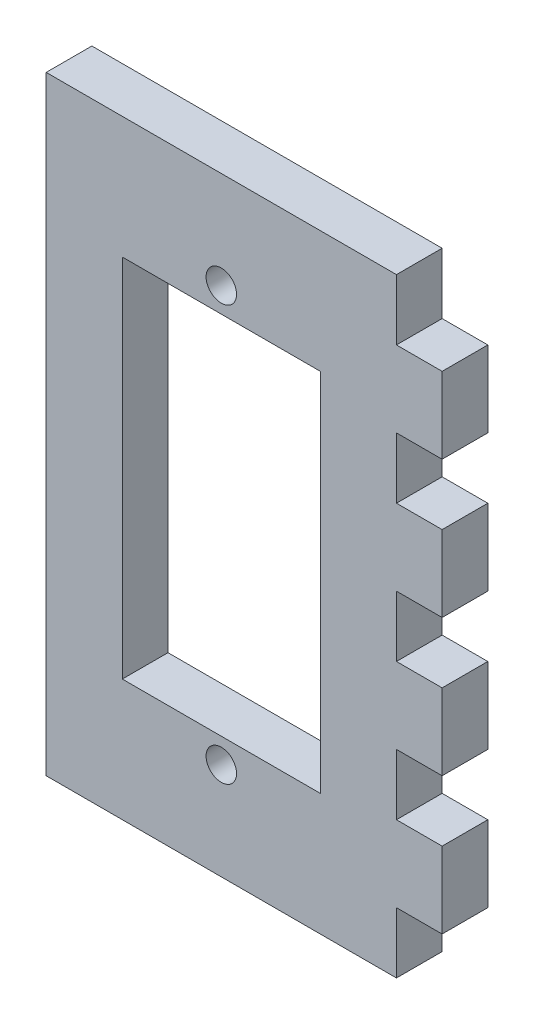
ISO-10303-21;
HEADER;
FILE_DESCRIPTION(('STEP AP214'),'2;1');
FILE_NAME('part.step','',(''),(''),'','','');
FILE_SCHEMA(('AUTOMOTIVE_DESIGN { 1 0 10303 214 1 1 1 1 }'));
ENDSEC;
DATA;
#1=APPLICATION_CONTEXT('core data for automotive mechanical design processes');
#2=APPLICATION_PROTOCOL_DEFINITION('international standard','automotive_design',2000,#1);
#3=PRODUCT_CONTEXT('',#1,'mechanical');
#4=PRODUCT('Part','Part','',(#3));
#5=PRODUCT_RELATED_PRODUCT_CATEGORY('part','',(#4));
#6=PRODUCT_DEFINITION_FORMATION('','',#4);
#7=PRODUCT_DEFINITION_CONTEXT('part definition',#1,'design');
#8=PRODUCT_DEFINITION('design','',#6,#7);
#9=PRODUCT_DEFINITION_SHAPE('','',#8);
#10=(LENGTH_UNIT() NAMED_UNIT(*) SI_UNIT(.MILLI.,.METRE.));
#11=(NAMED_UNIT(*) PLANE_ANGLE_UNIT() SI_UNIT($,.RADIAN.));
#12=(NAMED_UNIT(*) SI_UNIT($,.STERADIAN.) SOLID_ANGLE_UNIT());
#13=UNCERTAINTY_MEASURE_WITH_UNIT(LENGTH_MEASURE(1.E-05),#10,'distance_accuracy_value','');
#14=(GEOMETRIC_REPRESENTATION_CONTEXT(3) GLOBAL_UNCERTAINTY_ASSIGNED_CONTEXT((#13)) GLOBAL_UNIT_ASSIGNED_CONTEXT((#10,
#11,#12)) REPRESENTATION_CONTEXT('',''));
#15=CARTESIAN_POINT('',(0.,0.,0.));
#16=DIRECTION('',(0.,0.,1.));
#17=DIRECTION('',(1.,0.,0.));
#18=AXIS2_PLACEMENT_3D('',#15,#16,#17);
#19=CARTESIAN_POINT('',(0.,0.,3.));
#20=DIRECTION('',(0.,0.,-1.));
#21=DIRECTION('',(-1.,0.,0.));
#22=AXIS2_PLACEMENT_3D('',#19,#20,#21);
#23=PLANE('',#22);
#24=CARTESIAN_POINT('',(0.,13.625,3.));
#25=DIRECTION('',(0.,0.,1.));
#26=DIRECTION('',(1.,0.,0.));
#27=AXIS2_PLACEMENT_3D('',#24,#25,#26);
#28=CIRCLE('',#27,1.);
#29=CARTESIAN_POINT('',(1.,13.625,3.));
#30=VERTEX_POINT('',#29);
#31=EDGE_CURVE('E223',#30,#30,#28,.T.);
#32=ORIENTED_EDGE('',*,*,#31,.F.);
#33=EDGE_LOOP('',(#32));
#34=FACE_BOUND('',#33,.T.);
#35=DIRECTION('',(0.,1.,0.));
#36=VECTOR('',#35,1.);
#37=CARTESIAN_POINT('',(11.5,16.,3.));
#38=LINE('',#37,#36);
#39=CARTESIAN_POINT('',(11.5,16.,3.));
#40=VERTEX_POINT('',#39);
#41=CARTESIAN_POINT('',(11.5,20.,3.));
#42=VERTEX_POINT('',#41);
#43=EDGE_CURVE('E233',#40,#42,#38,.T.);
#44=ORIENTED_EDGE('',*,*,#43,.T.);
#45=DIRECTION('',(-1.,0.,0.));
#46=VECTOR('',#45,1.);
#47=CARTESIAN_POINT('',(-11.5,20.,3.));
#48=LINE('',#47,#46);
#49=CARTESIAN_POINT('',(-11.5,20.,3.));
#50=VERTEX_POINT('',#49);
#51=EDGE_CURVE('E236',#42,#50,#48,.T.);
#52=ORIENTED_EDGE('',*,*,#51,.T.);
#53=DIRECTION('',(0.,-1.,0.));
#54=VECTOR('',#53,1.);
#55=CARTESIAN_POINT('',(-11.5,-20.,3.));
#56=LINE('',#55,#54);
#57=CARTESIAN_POINT('',(-11.5,-20.,3.));
#58=VERTEX_POINT('',#57);
#59=EDGE_CURVE('E239',#50,#58,#56,.T.);
#60=ORIENTED_EDGE('',*,*,#59,.T.);
#61=DIRECTION('',(1.,0.,0.));
#62=VECTOR('',#61,1.);
#63=CARTESIAN_POINT('',(-11.5,-20.,3.));
#64=LINE('',#63,#62);
#65=CARTESIAN_POINT('',(11.5,-20.,3.));
#66=VERTEX_POINT('',#65);
#67=EDGE_CURVE('E241',#58,#66,#64,.T.);
#68=ORIENTED_EDGE('',*,*,#67,.T.);
#69=DIRECTION('',(0.,1.,0.));
#70=VECTOR('',#69,1.);
#71=CARTESIAN_POINT('',(11.5,-20.,3.));
#72=LINE('',#71,#70);
#73=CARTESIAN_POINT('',(11.5,-16.,3.));
#74=VERTEX_POINT('',#73);
#75=EDGE_CURVE('E243',#66,#74,#72,.T.);
#76=ORIENTED_EDGE('',*,*,#75,.T.);
#77=DIRECTION('',(1.,0.,0.));
#78=VECTOR('',#77,1.);
#79=CARTESIAN_POINT('',(11.5,-16.,3.));
#80=LINE('',#79,#78);
#81=CARTESIAN_POINT('',(14.5,-16.,3.));
#82=VERTEX_POINT('',#81);
#83=EDGE_CURVE('E245',#74,#82,#80,.T.);
#84=ORIENTED_EDGE('',*,*,#83,.T.);
#85=DIRECTION('',(0.,1.,0.));
#86=VECTOR('',#85,1.);
#87=CARTESIAN_POINT('',(14.5,-16.,3.));
#88=LINE('',#87,#86);
#89=CARTESIAN_POINT('',(14.5,-11.,3.));
#90=VERTEX_POINT('',#89);
#91=EDGE_CURVE('E247',#82,#90,#88,.T.);
#92=ORIENTED_EDGE('',*,*,#91,.T.);
#93=DIRECTION('',(-1.,0.,0.));
#94=VECTOR('',#93,1.);
#95=CARTESIAN_POINT('',(14.5,-11.,3.));
#96=LINE('',#95,#94);
#97=CARTESIAN_POINT('',(11.5,-11.,3.));
#98=VERTEX_POINT('',#97);
#99=EDGE_CURVE('E249',#90,#98,#96,.T.);
#100=ORIENTED_EDGE('',*,*,#99,.T.);
#101=DIRECTION('',(0.,1.,0.));
#102=VECTOR('',#101,1.);
#103=CARTESIAN_POINT('',(11.5,-11.,3.));
#104=LINE('',#103,#102);
#105=CARTESIAN_POINT('',(11.5,-7.00000000000001,3.));
#106=VERTEX_POINT('',#105);
#107=EDGE_CURVE('E251',#98,#106,#104,.T.);
#108=ORIENTED_EDGE('',*,*,#107,.T.);
#109=DIRECTION('',(1.,0.,0.));
#110=VECTOR('',#109,1.);
#111=CARTESIAN_POINT('',(11.5,-7.00000000000001,3.));
#112=LINE('',#111,#110);
#113=CARTESIAN_POINT('',(14.5,-7.00000000000001,3.));
#114=VERTEX_POINT('',#113);
#115=EDGE_CURVE('E253',#106,#114,#112,.T.);
#116=ORIENTED_EDGE('',*,*,#115,.T.);
#117=DIRECTION('',(0.,1.,0.));
#118=VECTOR('',#117,1.);
#119=CARTESIAN_POINT('',(14.5,-7.00000000000001,3.));
#120=LINE('',#119,#118);
#121=CARTESIAN_POINT('',(14.5,-2.00000000000001,3.));
#122=VERTEX_POINT('',#121);
#123=EDGE_CURVE('E255',#114,#122,#120,.T.);
#124=ORIENTED_EDGE('',*,*,#123,.T.);
#125=DIRECTION('',(-1.,0.,0.));
#126=VECTOR('',#125,1.);
#127=CARTESIAN_POINT('',(14.5,-2.00000000000001,3.));
#128=LINE('',#127,#126);
#129=CARTESIAN_POINT('',(11.5,-2.00000000000001,3.));
#130=VERTEX_POINT('',#129);
#131=EDGE_CURVE('E257',#122,#130,#128,.T.);
#132=ORIENTED_EDGE('',*,*,#131,.T.);
#133=DIRECTION('',(0.,1.,0.));
#134=VECTOR('',#133,1.);
#135=CARTESIAN_POINT('',(11.5,-2.00000000000001,3.));
#136=LINE('',#135,#134);
#137=CARTESIAN_POINT('',(11.5,2.,3.));
#138=VERTEX_POINT('',#137);
#139=EDGE_CURVE('E259',#130,#138,#136,.T.);
#140=ORIENTED_EDGE('',*,*,#139,.T.);
#141=DIRECTION('',(1.,0.,0.));
#142=VECTOR('',#141,1.);
#143=CARTESIAN_POINT('',(14.5,2.,3.));
#144=LINE('',#143,#142);
#145=CARTESIAN_POINT('',(14.5,2.,3.));
#146=VERTEX_POINT('',#145);
#147=EDGE_CURVE('E261',#138,#146,#144,.T.);
#148=ORIENTED_EDGE('',*,*,#147,.T.);
#149=DIRECTION('',(0.,1.,0.));
#150=VECTOR('',#149,1.);
#151=CARTESIAN_POINT('',(14.5,7.00000000000001,3.));
#152=LINE('',#151,#150);
#153=CARTESIAN_POINT('',(14.5,7.00000000000001,3.));
#154=VERTEX_POINT('',#153);
#155=EDGE_CURVE('E263',#146,#154,#152,.T.);
#156=ORIENTED_EDGE('',*,*,#155,.T.);
#157=DIRECTION('',(-1.,0.,0.));
#158=VECTOR('',#157,1.);
#159=CARTESIAN_POINT('',(11.5,7.00000000000001,3.));
#160=LINE('',#159,#158);
#161=CARTESIAN_POINT('',(11.5,7.00000000000001,3.));
#162=VERTEX_POINT('',#161);
#163=EDGE_CURVE('E265',#154,#162,#160,.T.);
#164=ORIENTED_EDGE('',*,*,#163,.T.);
#165=DIRECTION('',(0.,1.,0.));
#166=VECTOR('',#165,1.);
#167=CARTESIAN_POINT('',(11.5,7.00000000000001,3.));
#168=LINE('',#167,#166);
#169=CARTESIAN_POINT('',(11.5,11.,3.));
#170=VERTEX_POINT('',#169);
#171=EDGE_CURVE('E267',#162,#170,#168,.T.);
#172=ORIENTED_EDGE('',*,*,#171,.T.);
#173=DIRECTION('',(1.,0.,0.));
#174=VECTOR('',#173,1.);
#175=CARTESIAN_POINT('',(14.5,11.,3.));
#176=LINE('',#175,#174);
#177=CARTESIAN_POINT('',(14.5,11.,3.));
#178=VERTEX_POINT('',#177);
#179=EDGE_CURVE('E269',#170,#178,#176,.T.);
#180=ORIENTED_EDGE('',*,*,#179,.T.);
#181=DIRECTION('',(0.,1.,0.));
#182=VECTOR('',#181,1.);
#183=CARTESIAN_POINT('',(14.5,16.,3.));
#184=LINE('',#183,#182);
#185=CARTESIAN_POINT('',(14.5,16.,3.));
#186=VERTEX_POINT('',#185);
#187=EDGE_CURVE('E271',#178,#186,#184,.T.);
#188=ORIENTED_EDGE('',*,*,#187,.T.);
#189=DIRECTION('',(-1.,0.,0.));
#190=VECTOR('',#189,1.);
#191=CARTESIAN_POINT('',(11.5,16.,3.));
#192=LINE('',#191,#190);
#193=EDGE_CURVE('E273',#186,#40,#192,.T.);
#194=ORIENTED_EDGE('',*,*,#193,.T.);
#195=EDGE_LOOP('',(#44,#52,#60,#68,#76,#84,#92,#100,#108,#116,#124,#132,#140,#148,#156,#164,
#172,#180,#188,#194));
#196=FACE_BOUND('',#195,.T.);
#197=DIRECTION('',(0.,-1.,0.));
#198=VECTOR('',#197,1.);
#199=CARTESIAN_POINT('',(-6.50000000000001,-12.,3.));
#200=LINE('',#199,#198);
#201=CARTESIAN_POINT('',(-6.50000000000001,12.,3.));
#202=VERTEX_POINT('',#201);
#203=CARTESIAN_POINT('',(-6.50000000000001,-12.,3.));
#204=VERTEX_POINT('',#203);
#205=EDGE_CURVE('E194',#202,#204,#200,.T.);
#206=ORIENTED_EDGE('',*,*,#205,.F.);
#207=DIRECTION('',(-1.,0.,0.));
#208=VECTOR('',#207,1.);
#209=CARTESIAN_POINT('',(6.49999999999999,12.,3.));
#210=LINE('',#209,#208);
#211=CARTESIAN_POINT('',(6.49999999999999,12.,3.));
#212=VERTEX_POINT('',#211);
#213=EDGE_CURVE('E217',#212,#202,#210,.T.);
#214=ORIENTED_EDGE('',*,*,#213,.F.);
#215=DIRECTION('',(0.,1.,0.));
#216=VECTOR('',#215,1.);
#217=CARTESIAN_POINT('',(6.49999999999999,-12.,3.));
#218=LINE('',#217,#216);
#219=CARTESIAN_POINT('',(6.49999999999999,-12.,3.));
#220=VERTEX_POINT('',#219);
#221=EDGE_CURVE('E215',#220,#212,#218,.T.);
#222=ORIENTED_EDGE('',*,*,#221,.F.);
#223=DIRECTION('',(1.,0.,0.));
#224=VECTOR('',#223,1.);
#225=CARTESIAN_POINT('',(6.49999999999999,-12.,3.));
#226=LINE('',#225,#224);
#227=EDGE_CURVE('E202',#204,#220,#226,.T.);
#228=ORIENTED_EDGE('',*,*,#227,.F.);
#229=EDGE_LOOP('',(#206,#214,#222,#228));
#230=FACE_BOUND('',#229,.T.);
#231=CARTESIAN_POINT('',(0.,-13.625,3.));
#232=DIRECTION('',(0.,0.,1.));
#233=DIRECTION('',(-1.,0.,0.));
#234=AXIS2_PLACEMENT_3D('',#231,#232,#233);
#235=CIRCLE('',#234,1.);
#236=CARTESIAN_POINT('',(-1.,-13.625,3.));
#237=VERTEX_POINT('',#236);
#238=EDGE_CURVE('E704',#237,#237,#235,.T.);
#239=ORIENTED_EDGE('',*,*,#238,.F.);
#240=EDGE_LOOP('',(#239));
#241=FACE_BOUND('',#240,.T.);
#242=ADVANCED_FACE('F33',(#34,#196,#230,#241),#23,.F.);
#243=CARTESIAN_POINT('',(0.,0.,0.));
#244=DIRECTION('',(0.,0.,-1.));
#245=DIRECTION('',(-1.,0.,0.));
#246=AXIS2_PLACEMENT_3D('',#243,#244,#245);
#247=PLANE('',#246);
#248=CARTESIAN_POINT('',(0.,13.625,0.));
#249=DIRECTION('',(0.,0.,1.));
#250=DIRECTION('',(1.,0.,0.));
#251=AXIS2_PLACEMENT_3D('',#248,#249,#250);
#252=CIRCLE('',#251,1.);
#253=CARTESIAN_POINT('',(1.,13.625,0.));
#254=VERTEX_POINT('',#253);
#255=EDGE_CURVE('E710',#254,#254,#252,.T.);
#256=ORIENTED_EDGE('',*,*,#255,.T.);
#257=EDGE_LOOP('',(#256));
#258=FACE_BOUND('',#257,.T.);
#259=DIRECTION('',(0.,1.,0.));
#260=VECTOR('',#259,1.);
#261=CARTESIAN_POINT('',(11.5,16.,0.));
#262=LINE('',#261,#260);
#263=CARTESIAN_POINT('',(11.5,16.,0.));
#264=VERTEX_POINT('',#263);
#265=CARTESIAN_POINT('',(11.5,20.,0.));
#266=VERTEX_POINT('',#265);
#267=EDGE_CURVE('E210',#264,#266,#262,.T.);
#268=ORIENTED_EDGE('',*,*,#267,.F.);
#269=DIRECTION('',(-1.,0.,0.));
#270=VECTOR('',#269,1.);
#271=CARTESIAN_POINT('',(11.5,16.,0.));
#272=LINE('',#271,#270);
#273=CARTESIAN_POINT('',(14.5,16.,0.));
#274=VERTEX_POINT('',#273);
#275=EDGE_CURVE('E237',#274,#264,#272,.T.);
#276=ORIENTED_EDGE('',*,*,#275,.F.);
#277=DIRECTION('',(0.,1.,0.));
#278=VECTOR('',#277,1.);
#279=CARTESIAN_POINT('',(14.5,16.,0.));
#280=LINE('',#279,#278);
#281=CARTESIAN_POINT('',(14.5,11.,0.));
#282=VERTEX_POINT('',#281);
#283=EDGE_CURVE('E312',#282,#274,#280,.T.);
#284=ORIENTED_EDGE('',*,*,#283,.F.);
#285=DIRECTION('',(1.,0.,0.));
#286=VECTOR('',#285,1.);
#287=CARTESIAN_POINT('',(14.5,11.,0.));
#288=LINE('',#287,#286);
#289=CARTESIAN_POINT('',(11.5,11.,0.));
#290=VERTEX_POINT('',#289);
#291=EDGE_CURVE('E310',#290,#282,#288,.T.);
#292=ORIENTED_EDGE('',*,*,#291,.F.);
#293=DIRECTION('',(0.,1.,0.));
#294=VECTOR('',#293,1.);
#295=CARTESIAN_POINT('',(11.5,7.00000000000001,0.));
#296=LINE('',#295,#294);
#297=CARTESIAN_POINT('',(11.5,7.00000000000001,0.));
#298=VERTEX_POINT('',#297);
#299=EDGE_CURVE('E308',#298,#290,#296,.T.);
#300=ORIENTED_EDGE('',*,*,#299,.F.);
#301=DIRECTION('',(-1.,0.,0.));
#302=VECTOR('',#301,1.);
#303=CARTESIAN_POINT('',(11.5,7.00000000000001,0.));
#304=LINE('',#303,#302);
#305=CARTESIAN_POINT('',(14.5,7.00000000000001,0.));
#306=VERTEX_POINT('',#305);
#307=EDGE_CURVE('E306',#306,#298,#304,.T.);
#308=ORIENTED_EDGE('',*,*,#307,.F.);
#309=DIRECTION('',(0.,1.,0.));
#310=VECTOR('',#309,1.);
#311=CARTESIAN_POINT('',(14.5,7.00000000000001,0.));
#312=LINE('',#311,#310);
#313=CARTESIAN_POINT('',(14.5,2.,0.));
#314=VERTEX_POINT('',#313);
#315=EDGE_CURVE('E304',#314,#306,#312,.T.);
#316=ORIENTED_EDGE('',*,*,#315,.F.);
#317=DIRECTION('',(1.,0.,0.));
#318=VECTOR('',#317,1.);
#319=CARTESIAN_POINT('',(14.5,2.,0.));
#320=LINE('',#319,#318);
#321=CARTESIAN_POINT('',(11.5,2.,0.));
#322=VERTEX_POINT('',#321);
#323=EDGE_CURVE('E302',#322,#314,#320,.T.);
#324=ORIENTED_EDGE('',*,*,#323,.F.);
#325=DIRECTION('',(0.,1.,0.));
#326=VECTOR('',#325,1.);
#327=CARTESIAN_POINT('',(11.5,-2.00000000000001,0.));
#328=LINE('',#327,#326);
#329=CARTESIAN_POINT('',(11.5,-2.00000000000001,0.));
#330=VERTEX_POINT('',#329);
#331=EDGE_CURVE('E300',#330,#322,#328,.T.);
#332=ORIENTED_EDGE('',*,*,#331,.F.);
#333=DIRECTION('',(-1.,0.,0.));
#334=VECTOR('',#333,1.);
#335=CARTESIAN_POINT('',(14.5,-2.00000000000001,0.));
#336=LINE('',#335,#334);
#337=CARTESIAN_POINT('',(14.5,-2.00000000000001,0.));
#338=VERTEX_POINT('',#337);
#339=EDGE_CURVE('E298',#338,#330,#336,.T.);
#340=ORIENTED_EDGE('',*,*,#339,.F.);
#341=DIRECTION('',(0.,1.,0.));
#342=VECTOR('',#341,1.);
#343=CARTESIAN_POINT('',(14.5,-7.00000000000001,0.));
#344=LINE('',#343,#342);
#345=CARTESIAN_POINT('',(14.5,-7.00000000000001,0.));
#346=VERTEX_POINT('',#345);
#347=EDGE_CURVE('E296',#346,#338,#344,.T.);
#348=ORIENTED_EDGE('',*,*,#347,.F.);
#349=DIRECTION('',(1.,0.,0.));
#350=VECTOR('',#349,1.);
#351=CARTESIAN_POINT('',(11.5,-7.00000000000001,0.));
#352=LINE('',#351,#350);
#353=CARTESIAN_POINT('',(11.5,-7.00000000000001,0.));
#354=VERTEX_POINT('',#353);
#355=EDGE_CURVE('E294',#354,#346,#352,.T.);
#356=ORIENTED_EDGE('',*,*,#355,.F.);
#357=DIRECTION('',(0.,1.,0.));
#358=VECTOR('',#357,1.);
#359=CARTESIAN_POINT('',(11.5,-11.,0.));
#360=LINE('',#359,#358);
#361=CARTESIAN_POINT('',(11.5,-11.,0.));
#362=VERTEX_POINT('',#361);
#363=EDGE_CURVE('E292',#362,#354,#360,.T.);
#364=ORIENTED_EDGE('',*,*,#363,.F.);
#365=DIRECTION('',(-1.,0.,0.));
#366=VECTOR('',#365,1.);
#367=CARTESIAN_POINT('',(14.5,-11.,0.));
#368=LINE('',#367,#366);
#369=CARTESIAN_POINT('',(14.5,-11.,0.));
#370=VERTEX_POINT('',#369);
#371=EDGE_CURVE('E290',#370,#362,#368,.T.);
#372=ORIENTED_EDGE('',*,*,#371,.F.);
#373=DIRECTION('',(0.,1.,0.));
#374=VECTOR('',#373,1.);
#375=CARTESIAN_POINT('',(14.5,-16.,0.));
#376=LINE('',#375,#374);
#377=CARTESIAN_POINT('',(14.5,-16.,0.));
#378=VERTEX_POINT('',#377);
#379=EDGE_CURVE('E288',#378,#370,#376,.T.);
#380=ORIENTED_EDGE('',*,*,#379,.F.);
#381=DIRECTION('',(1.,0.,0.));
#382=VECTOR('',#381,1.);
#383=CARTESIAN_POINT('',(11.5,-16.,0.));
#384=LINE('',#383,#382);
#385=CARTESIAN_POINT('',(11.5,-16.,0.));
#386=VERTEX_POINT('',#385);
#387=EDGE_CURVE('E286',#386,#378,#384,.T.);
#388=ORIENTED_EDGE('',*,*,#387,.F.);
#389=DIRECTION('',(0.,1.,0.));
#390=VECTOR('',#389,1.);
#391=CARTESIAN_POINT('',(11.5,-20.,0.));
#392=LINE('',#391,#390);
#393=CARTESIAN_POINT('',(11.5,-20.,0.));
#394=VERTEX_POINT('',#393);
#395=EDGE_CURVE('E284',#394,#386,#392,.T.);
#396=ORIENTED_EDGE('',*,*,#395,.F.);
#397=DIRECTION('',(1.,0.,0.));
#398=VECTOR('',#397,1.);
#399=CARTESIAN_POINT('',(-11.5,-20.,0.));
#400=LINE('',#399,#398);
#401=CARTESIAN_POINT('',(-11.5,-20.,0.));
#402=VERTEX_POINT('',#401);
#403=EDGE_CURVE('E282',#402,#394,#400,.T.);
#404=ORIENTED_EDGE('',*,*,#403,.F.);
#405=DIRECTION('',(0.,-1.,0.));
#406=VECTOR('',#405,1.);
#407=CARTESIAN_POINT('',(-11.5,-20.,0.));
#408=LINE('',#407,#406);
#409=CARTESIAN_POINT('',(-11.5,20.,0.));
#410=VERTEX_POINT('',#409);
#411=EDGE_CURVE('E280',#410,#402,#408,.T.);
#412=ORIENTED_EDGE('',*,*,#411,.F.);
#413=DIRECTION('',(-1.,0.,0.));
#414=VECTOR('',#413,1.);
#415=CARTESIAN_POINT('',(-11.5,20.,0.));
#416=LINE('',#415,#414);
#417=EDGE_CURVE('E278',#266,#410,#416,.T.);
#418=ORIENTED_EDGE('',*,*,#417,.F.);
#419=EDGE_LOOP('',(#268,#276,#284,#292,#300,#308,#316,#324,#332,#340,#348,#356,#364,#372,#380,
#388,#396,#404,#412,#418));
#420=FACE_BOUND('',#419,.T.);
#421=DIRECTION('',(-1.,0.,0.));
#422=VECTOR('',#421,1.);
#423=CARTESIAN_POINT('',(6.49999999999999,12.,0.));
#424=LINE('',#423,#422);
#425=CARTESIAN_POINT('',(6.49999999999999,12.,0.));
#426=VERTEX_POINT('',#425);
#427=CARTESIAN_POINT('',(-6.50000000000001,12.,0.));
#428=VERTEX_POINT('',#427);
#429=EDGE_CURVE('E203',#426,#428,#424,.T.);
#430=ORIENTED_EDGE('',*,*,#429,.T.);
#431=DIRECTION('',(0.,-1.,0.));
#432=VECTOR('',#431,1.);
#433=CARTESIAN_POINT('',(-6.50000000000001,-12.,0.));
#434=LINE('',#433,#432);
#435=CARTESIAN_POINT('',(-6.50000000000001,-12.,0.));
#436=VERTEX_POINT('',#435);
#437=EDGE_CURVE('E56',#428,#436,#434,.T.);
#438=ORIENTED_EDGE('',*,*,#437,.T.);
#439=DIRECTION('',(1.,0.,0.));
#440=VECTOR('',#439,1.);
#441=CARTESIAN_POINT('',(6.49999999999999,-12.,0.));
#442=LINE('',#441,#440);
#443=CARTESIAN_POINT('',(6.49999999999999,-12.,0.));
#444=VERTEX_POINT('',#443);
#445=EDGE_CURVE('E209',#436,#444,#442,.T.);
#446=ORIENTED_EDGE('',*,*,#445,.T.);
#447=DIRECTION('',(0.,1.,0.));
#448=VECTOR('',#447,1.);
#449=CARTESIAN_POINT('',(6.49999999999999,-12.,0.));
#450=LINE('',#449,#448);
#451=EDGE_CURVE('E225',#444,#426,#450,.T.);
#452=ORIENTED_EDGE('',*,*,#451,.T.);
#453=EDGE_LOOP('',(#430,#438,#446,#452));
#454=FACE_BOUND('',#453,.T.);
#455=CARTESIAN_POINT('',(0.,-13.625,0.));
#456=DIRECTION('',(0.,0.,1.));
#457=DIRECTION('',(-1.,0.,0.));
#458=AXIS2_PLACEMENT_3D('',#455,#456,#457);
#459=CIRCLE('',#458,1.);
#460=CARTESIAN_POINT('',(-1.,-13.625,0.));
#461=VERTEX_POINT('',#460);
#462=EDGE_CURVE('E707',#461,#461,#459,.T.);
#463=ORIENTED_EDGE('',*,*,#462,.T.);
#464=EDGE_LOOP('',(#463));
#465=FACE_BOUND('',#464,.T.);
#466=ADVANCED_FACE('F378',(#258,#420,#454,#465),#247,.T.);
#467=CARTESIAN_POINT('',(11.5,16.,3.));
#468=DIRECTION('',(-1.,0.,0.));
#469=DIRECTION('',(0.,0.,1.));
#470=AXIS2_PLACEMENT_3D('',#467,#468,#469);
#471=PLANE('',#470);
#472=ORIENTED_EDGE('',*,*,#267,.T.);
#473=DIRECTION('',(0.,0.,-1.));
#474=VECTOR('',#473,1.);
#475=CARTESIAN_POINT('',(11.5,20.,3.));
#476=LINE('',#475,#474);
#477=EDGE_CURVE('E11',#42,#266,#476,.T.);
#478=ORIENTED_EDGE('',*,*,#477,.F.);
#479=ORIENTED_EDGE('',*,*,#43,.F.);
#480=DIRECTION('',(0.,0.,-1.));
#481=VECTOR('',#480,1.);
#482=CARTESIAN_POINT('',(11.5,16.,3.));
#483=LINE('',#482,#481);
#484=EDGE_CURVE('E275',#40,#264,#483,.T.);
#485=ORIENTED_EDGE('',*,*,#484,.T.);
#486=EDGE_LOOP('',(#472,#478,#479,#485));
#487=FACE_BOUND('',#486,.T.);
#488=ADVANCED_FACE('F35',(#487),#471,.F.);
#489=CARTESIAN_POINT('',(-11.5,20.,3.));
#490=DIRECTION('',(0.,-1.,0.));
#491=DIRECTION('',(0.,0.,-1.));
#492=AXIS2_PLACEMENT_3D('',#489,#490,#491);
#493=PLANE('',#492);
#494=ORIENTED_EDGE('',*,*,#417,.T.);
#495=DIRECTION('',(0.,0.,-1.));
#496=VECTOR('',#495,1.);
#497=CARTESIAN_POINT('',(-11.5,20.,3.));
#498=LINE('',#497,#496);
#499=EDGE_CURVE('E41',#50,#410,#498,.T.);
#500=ORIENTED_EDGE('',*,*,#499,.F.);
#501=ORIENTED_EDGE('',*,*,#51,.F.);
#502=ORIENTED_EDGE('',*,*,#477,.T.);
#503=EDGE_LOOP('',(#494,#500,#501,#502));
#504=FACE_BOUND('',#503,.T.);
#505=ADVANCED_FACE('F395',(#504),#493,.F.);
#506=CARTESIAN_POINT('',(-11.5,-20.,3.));
#507=DIRECTION('',(1.,0.,0.));
#508=DIRECTION('',(0.,1.,0.));
#509=AXIS2_PLACEMENT_3D('',#506,#507,#508);
#510=PLANE('',#509);
#511=ORIENTED_EDGE('',*,*,#411,.T.);
#512=DIRECTION('',(0.,0.,-1.));
#513=VECTOR('',#512,1.);
#514=CARTESIAN_POINT('',(-11.5,-20.,3.));
#515=LINE('',#514,#513);
#516=EDGE_CURVE('E365',#58,#402,#515,.T.);
#517=ORIENTED_EDGE('',*,*,#516,.F.);
#518=ORIENTED_EDGE('',*,*,#59,.F.);
#519=ORIENTED_EDGE('',*,*,#499,.T.);
#520=EDGE_LOOP('',(#511,#517,#518,#519));
#521=FACE_BOUND('',#520,.T.);
#522=ADVANCED_FACE('F372',(#521),#510,.F.);
#523=CARTESIAN_POINT('',(-11.5,-20.,3.));
#524=DIRECTION('',(0.,1.,0.));
#525=DIRECTION('',(0.,0.,1.));
#526=AXIS2_PLACEMENT_3D('',#523,#524,#525);
#527=PLANE('',#526);
#528=ORIENTED_EDGE('',*,*,#403,.T.);
#529=DIRECTION('',(0.,0.,-1.));
#530=VECTOR('',#529,1.);
#531=CARTESIAN_POINT('',(11.5,-20.,3.));
#532=LINE('',#531,#530);
#533=EDGE_CURVE('E362',#66,#394,#532,.T.);
#534=ORIENTED_EDGE('',*,*,#533,.F.);
#535=ORIENTED_EDGE('',*,*,#67,.F.);
#536=ORIENTED_EDGE('',*,*,#516,.T.);
#537=EDGE_LOOP('',(#528,#534,#535,#536));
#538=FACE_BOUND('',#537,.T.);
#539=ADVANCED_FACE('F384',(#538),#527,.F.);
#540=CARTESIAN_POINT('',(11.5,-20.,3.));
#541=DIRECTION('',(-1.,0.,0.));
#542=DIRECTION('',(0.,0.,1.));
#543=AXIS2_PLACEMENT_3D('',#540,#541,#542);
#544=PLANE('',#543);
#545=ORIENTED_EDGE('',*,*,#395,.T.);
#546=DIRECTION('',(0.,0.,-1.));
#547=VECTOR('',#546,1.);
#548=CARTESIAN_POINT('',(11.5,-16.,3.));
#549=LINE('',#548,#547);
#550=EDGE_CURVE('E359',#74,#386,#549,.T.);
#551=ORIENTED_EDGE('',*,*,#550,.F.);
#552=ORIENTED_EDGE('',*,*,#75,.F.);
#553=ORIENTED_EDGE('',*,*,#533,.T.);
#554=EDGE_LOOP('',(#545,#551,#552,#553));
#555=FACE_BOUND('',#554,.T.);
#556=ADVANCED_FACE('F388',(#555),#544,.F.);
#557=CARTESIAN_POINT('',(11.5,-16.,3.));
#558=DIRECTION('',(0.,1.,0.));
#559=DIRECTION('',(0.,0.,1.));
#560=AXIS2_PLACEMENT_3D('',#557,#558,#559);
#561=PLANE('',#560);
#562=ORIENTED_EDGE('',*,*,#387,.T.);
#563=DIRECTION('',(0.,0.,-1.));
#564=VECTOR('',#563,1.);
#565=CARTESIAN_POINT('',(14.5,-16.,3.));
#566=LINE('',#565,#564);
#567=EDGE_CURVE('E356',#82,#378,#566,.T.);
#568=ORIENTED_EDGE('',*,*,#567,.F.);
#569=ORIENTED_EDGE('',*,*,#83,.F.);
#570=ORIENTED_EDGE('',*,*,#550,.T.);
#571=EDGE_LOOP('',(#562,#568,#569,#570));
#572=FACE_BOUND('',#571,.T.);
#573=ADVANCED_FACE('F468',(#572),#561,.F.);
#574=CARTESIAN_POINT('',(14.5,-16.,3.));
#575=DIRECTION('',(-1.,0.,0.));
#576=DIRECTION('',(0.,0.,1.));
#577=AXIS2_PLACEMENT_3D('',#574,#575,#576);
#578=PLANE('',#577);
#579=ORIENTED_EDGE('',*,*,#379,.T.);
#580=DIRECTION('',(0.,0.,-1.));
#581=VECTOR('',#580,1.);
#582=CARTESIAN_POINT('',(14.5,-11.,3.));
#583=LINE('',#582,#581);
#584=EDGE_CURVE('E353',#90,#370,#583,.T.);
#585=ORIENTED_EDGE('',*,*,#584,.F.);
#586=ORIENTED_EDGE('',*,*,#91,.F.);
#587=ORIENTED_EDGE('',*,*,#567,.T.);
#588=EDGE_LOOP('',(#579,#585,#586,#587));
#589=FACE_BOUND('',#588,.T.);
#590=ADVANCED_FACE('F466',(#589),#578,.F.);
#591=CARTESIAN_POINT('',(14.5,-11.,3.));
#592=DIRECTION('',(0.,-1.,0.));
#593=DIRECTION('',(1.,0.,0.));
#594=AXIS2_PLACEMENT_3D('',#591,#592,#593);
#595=PLANE('',#594);
#596=ORIENTED_EDGE('',*,*,#371,.T.);
#597=DIRECTION('',(0.,0.,-1.));
#598=VECTOR('',#597,1.);
#599=CARTESIAN_POINT('',(11.5,-11.,3.));
#600=LINE('',#599,#598);
#601=EDGE_CURVE('E350',#98,#362,#600,.T.);
#602=ORIENTED_EDGE('',*,*,#601,.F.);
#603=ORIENTED_EDGE('',*,*,#99,.F.);
#604=ORIENTED_EDGE('',*,*,#584,.T.);
#605=EDGE_LOOP('',(#596,#602,#603,#604));
#606=FACE_BOUND('',#605,.T.);
#607=ADVANCED_FACE('F461',(#606),#595,.F.);
#608=CARTESIAN_POINT('',(11.5,-11.,3.));
#609=DIRECTION('',(-1.,0.,0.));
#610=DIRECTION('',(0.,0.,1.));
#611=AXIS2_PLACEMENT_3D('',#608,#609,#610);
#612=PLANE('',#611);
#613=ORIENTED_EDGE('',*,*,#363,.T.);
#614=DIRECTION('',(0.,0.,-1.));
#615=VECTOR('',#614,1.);
#616=CARTESIAN_POINT('',(11.5,-7.00000000000001,3.));
#617=LINE('',#616,#615);
#618=EDGE_CURVE('E347',#106,#354,#617,.T.);
#619=ORIENTED_EDGE('',*,*,#618,.F.);
#620=ORIENTED_EDGE('',*,*,#107,.F.);
#621=ORIENTED_EDGE('',*,*,#601,.T.);
#622=EDGE_LOOP('',(#613,#619,#620,#621));
#623=FACE_BOUND('',#622,.T.);
#624=ADVANCED_FACE('F456',(#623),#612,.F.);
#625=CARTESIAN_POINT('',(11.5,-7.00000000000001,3.));
#626=DIRECTION('',(0.,1.,0.));
#627=DIRECTION('',(0.,0.,1.));
#628=AXIS2_PLACEMENT_3D('',#625,#626,#627);
#629=PLANE('',#628);
#630=ORIENTED_EDGE('',*,*,#355,.T.);
#631=DIRECTION('',(0.,0.,-1.));
#632=VECTOR('',#631,1.);
#633=CARTESIAN_POINT('',(14.5,-7.00000000000001,3.));
#634=LINE('',#633,#632);
#635=EDGE_CURVE('E344',#114,#346,#634,.T.);
#636=ORIENTED_EDGE('',*,*,#635,.F.);
#637=ORIENTED_EDGE('',*,*,#115,.F.);
#638=ORIENTED_EDGE('',*,*,#618,.T.);
#639=EDGE_LOOP('',(#630,#636,#637,#638));
#640=FACE_BOUND('',#639,.T.);
#641=ADVANCED_FACE('F452',(#640),#629,.F.);
#642=CARTESIAN_POINT('',(14.5,-7.00000000000001,3.));
#643=DIRECTION('',(-1.,0.,0.));
#644=DIRECTION('',(0.,0.,1.));
#645=AXIS2_PLACEMENT_3D('',#642,#643,#644);
#646=PLANE('',#645);
#647=ORIENTED_EDGE('',*,*,#347,.T.);
#648=DIRECTION('',(0.,0.,-1.));
#649=VECTOR('',#648,1.);
#650=CARTESIAN_POINT('',(14.5,-2.00000000000001,3.));
#651=LINE('',#650,#649);
#652=EDGE_CURVE('E341',#122,#338,#651,.T.);
#653=ORIENTED_EDGE('',*,*,#652,.F.);
#654=ORIENTED_EDGE('',*,*,#123,.F.);
#655=ORIENTED_EDGE('',*,*,#635,.T.);
#656=EDGE_LOOP('',(#647,#653,#654,#655));
#657=FACE_BOUND('',#656,.T.);
#658=ADVANCED_FACE('F447',(#657),#646,.F.);
#659=CARTESIAN_POINT('',(14.5,-2.00000000000001,3.));
#660=DIRECTION('',(0.,-1.,0.));
#661=DIRECTION('',(1.,0.,0.));
#662=AXIS2_PLACEMENT_3D('',#659,#660,#661);
#663=PLANE('',#662);
#664=ORIENTED_EDGE('',*,*,#339,.T.);
#665=DIRECTION('',(0.,0.,-1.));
#666=VECTOR('',#665,1.);
#667=CARTESIAN_POINT('',(11.5,-2.00000000000001,3.));
#668=LINE('',#667,#666);
#669=EDGE_CURVE('E338',#130,#330,#668,.T.);
#670=ORIENTED_EDGE('',*,*,#669,.F.);
#671=ORIENTED_EDGE('',*,*,#131,.F.);
#672=ORIENTED_EDGE('',*,*,#652,.T.);
#673=EDGE_LOOP('',(#664,#670,#671,#672));
#674=FACE_BOUND('',#673,.T.);
#675=ADVANCED_FACE('F441',(#674),#663,.F.);
#676=CARTESIAN_POINT('',(11.5,-2.00000000000001,3.));
#677=DIRECTION('',(-1.,0.,0.));
#678=DIRECTION('',(0.,0.,1.));
#679=AXIS2_PLACEMENT_3D('',#676,#677,#678);
#680=PLANE('',#679);
#681=ORIENTED_EDGE('',*,*,#331,.T.);
#682=DIRECTION('',(0.,0.,-1.));
#683=VECTOR('',#682,1.);
#684=CARTESIAN_POINT('',(11.5,2.,3.));
#685=LINE('',#684,#683);
#686=EDGE_CURVE('E335',#138,#322,#685,.T.);
#687=ORIENTED_EDGE('',*,*,#686,.F.);
#688=ORIENTED_EDGE('',*,*,#139,.F.);
#689=ORIENTED_EDGE('',*,*,#669,.T.);
#690=EDGE_LOOP('',(#681,#687,#688,#689));
#691=FACE_BOUND('',#690,.T.);
#692=ADVANCED_FACE('F437',(#691),#680,.F.);
#693=CARTESIAN_POINT('',(14.5,2.,3.));
#694=DIRECTION('',(0.,1.,0.));
#695=DIRECTION('',(-1.,0.,0.));
#696=AXIS2_PLACEMENT_3D('',#693,#694,#695);
#697=PLANE('',#696);
#698=ORIENTED_EDGE('',*,*,#323,.T.);
#699=DIRECTION('',(0.,0.,-1.));
#700=VECTOR('',#699,1.);
#701=CARTESIAN_POINT('',(14.5,2.,3.));
#702=LINE('',#701,#700);
#703=EDGE_CURVE('E332',#146,#314,#702,.T.);
#704=ORIENTED_EDGE('',*,*,#703,.F.);
#705=ORIENTED_EDGE('',*,*,#147,.F.);
#706=ORIENTED_EDGE('',*,*,#686,.T.);
#707=EDGE_LOOP('',(#698,#704,#705,#706));
#708=FACE_BOUND('',#707,.T.);
#709=ADVANCED_FACE('F432',(#708),#697,.F.);
#710=CARTESIAN_POINT('',(14.5,7.00000000000001,3.));
#711=DIRECTION('',(-1.,0.,0.));
#712=DIRECTION('',(0.,0.,1.));
#713=AXIS2_PLACEMENT_3D('',#710,#711,#712);
#714=PLANE('',#713);
#715=ORIENTED_EDGE('',*,*,#315,.T.);
#716=DIRECTION('',(0.,0.,-1.));
#717=VECTOR('',#716,1.);
#718=CARTESIAN_POINT('',(14.5,7.00000000000001,3.));
#719=LINE('',#718,#717);
#720=EDGE_CURVE('E329',#154,#306,#719,.T.);
#721=ORIENTED_EDGE('',*,*,#720,.F.);
#722=ORIENTED_EDGE('',*,*,#155,.F.);
#723=ORIENTED_EDGE('',*,*,#703,.T.);
#724=EDGE_LOOP('',(#715,#721,#722,#723));
#725=FACE_BOUND('',#724,.T.);
#726=ADVANCED_FACE('F426',(#725),#714,.F.);
#727=CARTESIAN_POINT('',(11.5,7.00000000000001,3.));
#728=DIRECTION('',(0.,-1.,0.));
#729=DIRECTION('',(1.,0.,0.));
#730=AXIS2_PLACEMENT_3D('',#727,#728,#729);
#731=PLANE('',#730);
#732=ORIENTED_EDGE('',*,*,#307,.T.);
#733=DIRECTION('',(0.,0.,-1.));
#734=VECTOR('',#733,1.);
#735=CARTESIAN_POINT('',(11.5,7.00000000000001,3.));
#736=LINE('',#735,#734);
#737=EDGE_CURVE('E326',#162,#298,#736,.T.);
#738=ORIENTED_EDGE('',*,*,#737,.F.);
#739=ORIENTED_EDGE('',*,*,#163,.F.);
#740=ORIENTED_EDGE('',*,*,#720,.T.);
#741=EDGE_LOOP('',(#732,#738,#739,#740));
#742=FACE_BOUND('',#741,.T.);
#743=ADVANCED_FACE('F422',(#742),#731,.F.);
#744=CARTESIAN_POINT('',(11.5,7.00000000000001,3.));
#745=DIRECTION('',(-1.,0.,0.));
#746=DIRECTION('',(0.,0.,1.));
#747=AXIS2_PLACEMENT_3D('',#744,#745,#746);
#748=PLANE('',#747);
#749=ORIENTED_EDGE('',*,*,#299,.T.);
#750=DIRECTION('',(0.,0.,-1.));
#751=VECTOR('',#750,1.);
#752=CARTESIAN_POINT('',(11.5,11.,3.));
#753=LINE('',#752,#751);
#754=EDGE_CURVE('E323',#170,#290,#753,.T.);
#755=ORIENTED_EDGE('',*,*,#754,.F.);
#756=ORIENTED_EDGE('',*,*,#171,.F.);
#757=ORIENTED_EDGE('',*,*,#737,.T.);
#758=EDGE_LOOP('',(#749,#755,#756,#757));
#759=FACE_BOUND('',#758,.T.);
#760=ADVANCED_FACE('F417',(#759),#748,.F.);
#761=CARTESIAN_POINT('',(14.5,11.,3.));
#762=DIRECTION('',(0.,1.,0.));
#763=DIRECTION('',(-1.,0.,0.));
#764=AXIS2_PLACEMENT_3D('',#761,#762,#763);
#765=PLANE('',#764);
#766=ORIENTED_EDGE('',*,*,#291,.T.);
#767=DIRECTION('',(0.,0.,-1.));
#768=VECTOR('',#767,1.);
#769=CARTESIAN_POINT('',(14.5,11.,3.));
#770=LINE('',#769,#768);
#771=EDGE_CURVE('E320',#178,#282,#770,.T.);
#772=ORIENTED_EDGE('',*,*,#771,.F.);
#773=ORIENTED_EDGE('',*,*,#179,.F.);
#774=ORIENTED_EDGE('',*,*,#754,.T.);
#775=EDGE_LOOP('',(#766,#772,#773,#774));
#776=FACE_BOUND('',#775,.T.);
#777=ADVANCED_FACE('F411',(#776),#765,.F.);
#778=CARTESIAN_POINT('',(14.5,16.,3.));
#779=DIRECTION('',(-1.,0.,0.));
#780=DIRECTION('',(0.,0.,1.));
#781=AXIS2_PLACEMENT_3D('',#778,#779,#780);
#782=PLANE('',#781);
#783=ORIENTED_EDGE('',*,*,#283,.T.);
#784=DIRECTION('',(0.,0.,-1.));
#785=VECTOR('',#784,1.);
#786=CARTESIAN_POINT('',(14.5,16.,3.));
#787=LINE('',#786,#785);
#788=EDGE_CURVE('E317',#186,#274,#787,.T.);
#789=ORIENTED_EDGE('',*,*,#788,.F.);
#790=ORIENTED_EDGE('',*,*,#187,.F.);
#791=ORIENTED_EDGE('',*,*,#771,.T.);
#792=EDGE_LOOP('',(#783,#789,#790,#791));
#793=FACE_BOUND('',#792,.T.);
#794=ADVANCED_FACE('F407',(#793),#782,.F.);
#795=CARTESIAN_POINT('',(11.5,16.,3.));
#796=DIRECTION('',(0.,-1.,0.));
#797=DIRECTION('',(0.,0.,-1.));
#798=AXIS2_PLACEMENT_3D('',#795,#796,#797);
#799=PLANE('',#798);
#800=ORIENTED_EDGE('',*,*,#275,.T.);
#801=ORIENTED_EDGE('',*,*,#484,.F.);
#802=ORIENTED_EDGE('',*,*,#193,.F.);
#803=ORIENTED_EDGE('',*,*,#788,.T.);
#804=EDGE_LOOP('',(#800,#801,#802,#803));
#805=FACE_BOUND('',#804,.T.);
#806=ADVANCED_FACE('F402',(#805),#799,.F.);
#807=CARTESIAN_POINT('',(-6.50000000000001,-12.,3.));
#808=DIRECTION('',(1.,0.,0.));
#809=DIRECTION('',(0.,0.,-1.));
#810=AXIS2_PLACEMENT_3D('',#807,#808,#809);
#811=PLANE('',#810);
#812=ORIENTED_EDGE('',*,*,#437,.F.);
#813=DIRECTION('',(0.,0.,-1.));
#814=VECTOR('',#813,1.);
#815=CARTESIAN_POINT('',(-6.50000000000001,12.,3.));
#816=LINE('',#815,#814);
#817=EDGE_CURVE('E198',#202,#428,#816,.T.);
#818=ORIENTED_EDGE('',*,*,#817,.F.);
#819=ORIENTED_EDGE('',*,*,#205,.T.);
#820=DIRECTION('',(0.,0.,-1.));
#821=VECTOR('',#820,1.);
#822=CARTESIAN_POINT('',(-6.50000000000001,-12.,3.));
#823=LINE('',#822,#821);
#824=EDGE_CURVE('E197',#204,#436,#823,.T.);
#825=ORIENTED_EDGE('',*,*,#824,.T.);
#826=EDGE_LOOP('',(#812,#818,#819,#825));
#827=FACE_BOUND('',#826,.T.);
#828=ADVANCED_FACE('F196',(#827),#811,.T.);
#829=CARTESIAN_POINT('',(6.49999999999999,-12.,3.));
#830=DIRECTION('',(0.,1.,0.));
#831=DIRECTION('',(0.,0.,1.));
#832=AXIS2_PLACEMENT_3D('',#829,#830,#831);
#833=PLANE('',#832);
#834=ORIENTED_EDGE('',*,*,#445,.F.);
#835=ORIENTED_EDGE('',*,*,#824,.F.);
#836=ORIENTED_EDGE('',*,*,#227,.T.);
#837=DIRECTION('',(0.,0.,-1.));
#838=VECTOR('',#837,1.);
#839=CARTESIAN_POINT('',(6.49999999999999,-12.,3.));
#840=LINE('',#839,#838);
#841=EDGE_CURVE('E211',#220,#444,#840,.T.);
#842=ORIENTED_EDGE('',*,*,#841,.T.);
#843=EDGE_LOOP('',(#834,#835,#836,#842));
#844=FACE_BOUND('',#843,.T.);
#845=ADVANCED_FACE('F206',(#844),#833,.T.);
#846=CARTESIAN_POINT('',(6.49999999999999,-12.,3.));
#847=DIRECTION('',(-1.,0.,0.));
#848=DIRECTION('',(0.,0.,1.));
#849=AXIS2_PLACEMENT_3D('',#846,#847,#848);
#850=PLANE('',#849);
#851=ORIENTED_EDGE('',*,*,#451,.F.);
#852=ORIENTED_EDGE('',*,*,#841,.F.);
#853=ORIENTED_EDGE('',*,*,#221,.T.);
#854=DIRECTION('',(0.,0.,-1.));
#855=VECTOR('',#854,1.);
#856=CARTESIAN_POINT('',(6.49999999999999,12.,3.));
#857=LINE('',#856,#855);
#858=EDGE_CURVE('E48',#212,#426,#857,.T.);
#859=ORIENTED_EDGE('',*,*,#858,.T.);
#860=EDGE_LOOP('',(#851,#852,#853,#859));
#861=FACE_BOUND('',#860,.T.);
#862=ADVANCED_FACE('F577',(#861),#850,.T.);
#863=CARTESIAN_POINT('',(6.49999999999999,12.,3.));
#864=DIRECTION('',(0.,-1.,0.));
#865=DIRECTION('',(0.,0.,-1.));
#866=AXIS2_PLACEMENT_3D('',#863,#864,#865);
#867=PLANE('',#866);
#868=ORIENTED_EDGE('',*,*,#429,.F.);
#869=ORIENTED_EDGE('',*,*,#858,.F.);
#870=ORIENTED_EDGE('',*,*,#213,.T.);
#871=ORIENTED_EDGE('',*,*,#817,.T.);
#872=EDGE_LOOP('',(#868,#869,#870,#871));
#873=FACE_BOUND('',#872,.T.);
#874=ADVANCED_FACE('F583',(#873),#867,.T.);
#875=CARTESIAN_POINT('',(0.,13.625,3.));
#876=DIRECTION('',(0.,0.,-1.));
#877=DIRECTION('',(-1.,0.,0.));
#878=AXIS2_PLACEMENT_3D('',#875,#876,#877);
#879=CYLINDRICAL_SURFACE('',#878,1.);
#880=ORIENTED_EDGE('',*,*,#31,.T.);
#881=EDGE_LOOP('',(#880));
#882=FACE_BOUND('',#881,.T.);
#883=ORIENTED_EDGE('',*,*,#255,.F.);
#884=EDGE_LOOP('',(#883));
#885=FACE_BOUND('',#884,.T.);
#886=ADVANCED_FACE('F591',(#882,#885),#879,.F.);
#887=CARTESIAN_POINT('',(0.,-13.625,3.));
#888=DIRECTION('',(0.,0.,-1.));
#889=DIRECTION('',(-1.,0.,0.));
#890=AXIS2_PLACEMENT_3D('',#887,#888,#889);
#891=CYLINDRICAL_SURFACE('',#890,1.);
#892=ORIENTED_EDGE('',*,*,#238,.T.);
#893=EDGE_LOOP('',(#892));
#894=FACE_BOUND('',#893,.T.);
#895=ORIENTED_EDGE('',*,*,#462,.F.);
#896=EDGE_LOOP('',(#895));
#897=FACE_BOUND('',#896,.T.);
#898=ADVANCED_FACE('F598',(#894,#897),#891,.F.);
#899=CLOSED_SHELL('',(#242,#466,#488,#505,#522,#539,#556,#573,#590,#607,#624,#641,#658,#675,
#692,#709,#726,#743,#760,#777,#794,#806,#828,#845,#862,#874,#886,#898));
#900=MANIFOLD_SOLID_BREP('B2',#899);
#901=ADVANCED_BREP_SHAPE_REPRESENTATION('',(#18,#900),#14);
#902=SHAPE_DEFINITION_REPRESENTATION(#9,#901);
ENDSEC;
END-ISO-10303-21;
